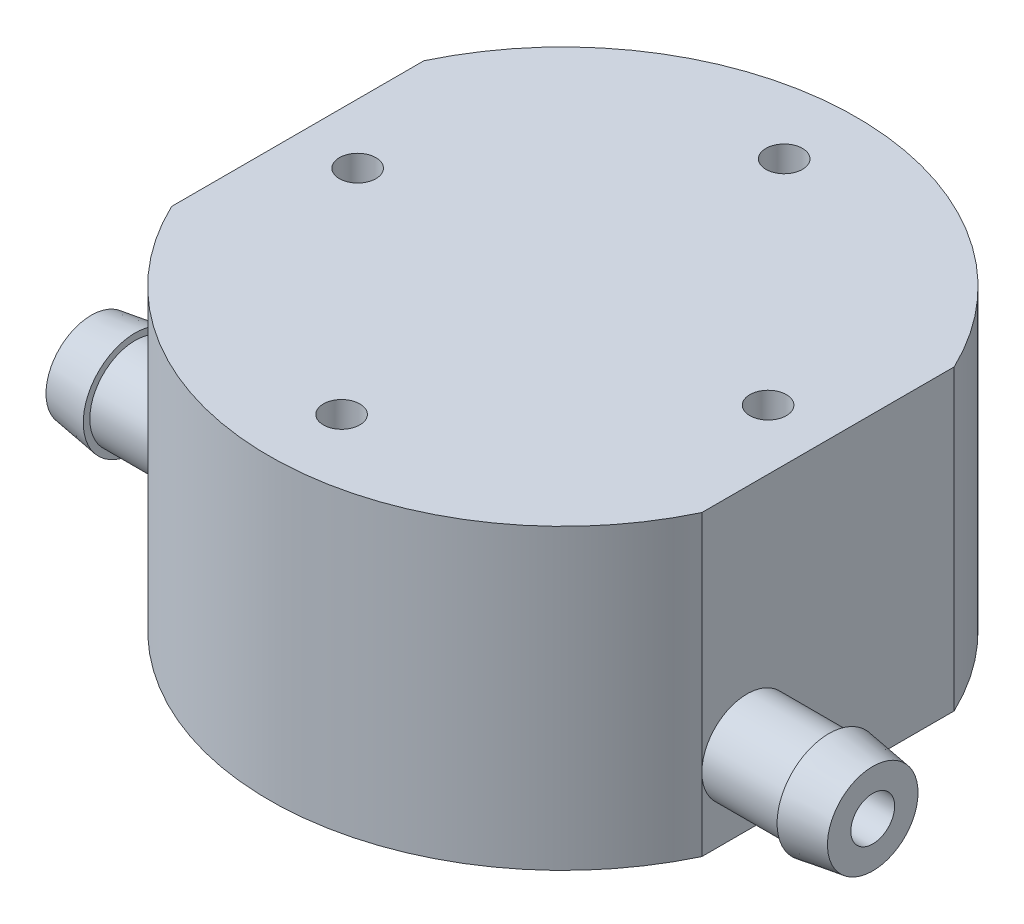
ISO-10303-21;
HEADER;
FILE_DESCRIPTION(('STEP AP214'),'2;1');
FILE_NAME('part.step','',(''),(''),'','','');
FILE_SCHEMA(('AUTOMOTIVE_DESIGN { 1 0 10303 214 1 1 1 1 }'));
ENDSEC;
DATA;
#1=APPLICATION_CONTEXT('core data for automotive mechanical design processes');
#2=APPLICATION_PROTOCOL_DEFINITION('international standard','automotive_design',2000,#1);
#3=PRODUCT_CONTEXT('',#1,'mechanical');
#4=PRODUCT('Part','Part','',(#3));
#5=PRODUCT_RELATED_PRODUCT_CATEGORY('part','',(#4));
#6=PRODUCT_DEFINITION_FORMATION('','',#4);
#7=PRODUCT_DEFINITION_CONTEXT('part definition',#1,'design');
#8=PRODUCT_DEFINITION('design','',#6,#7);
#9=PRODUCT_DEFINITION_SHAPE('','',#8);
#10=(LENGTH_UNIT() NAMED_UNIT(*) SI_UNIT(.MILLI.,.METRE.));
#11=(NAMED_UNIT(*) PLANE_ANGLE_UNIT() SI_UNIT($,.RADIAN.));
#12=(NAMED_UNIT(*) SI_UNIT($,.STERADIAN.) SOLID_ANGLE_UNIT());
#13=UNCERTAINTY_MEASURE_WITH_UNIT(LENGTH_MEASURE(1.E-05),#10,'distance_accuracy_value','');
#14=(GEOMETRIC_REPRESENTATION_CONTEXT(3) GLOBAL_UNCERTAINTY_ASSIGNED_CONTEXT((#13)) GLOBAL_UNIT_ASSIGNED_CONTEXT((#10,
#11,#12)) REPRESENTATION_CONTEXT('',''));
#15=CARTESIAN_POINT('',(0.,0.,0.));
#16=DIRECTION('',(0.,0.,1.));
#17=DIRECTION('',(1.,0.,0.));
#18=AXIS2_PLACEMENT_3D('',#15,#16,#17);
#19=CARTESIAN_POINT('',(0.,-20.4,0.));
#20=DIRECTION('',(0.,1.,0.));
#21=DIRECTION('',(0.,0.,1.));
#22=AXIS2_PLACEMENT_3D('',#19,#20,#21);
#23=CYLINDRICAL_SURFACE('',#22,20.1);
#24=CARTESIAN_POINT('',(0.,0.,0.));
#25=DIRECTION('',(0.,1.,0.));
#26=DIRECTION('',(0.,0.,1.));
#27=AXIS2_PLACEMENT_3D('',#24,#25,#26);
#28=CIRCLE('',#27,20.1);
#29=CARTESIAN_POINT('',(18.15,0.,-8.63640550229087));
#30=VERTEX_POINT('',#29);
#31=CARTESIAN_POINT('',(-18.15,0.,-8.63640550229087));
#32=VERTEX_POINT('',#31);
#33=EDGE_CURVE('E126',#30,#32,#28,.T.);
#34=ORIENTED_EDGE('',*,*,#33,.F.);
#35=DIRECTION('',(0.,1.,0.));
#36=VECTOR('',#35,1.);
#37=CARTESIAN_POINT('',(18.15,-20.4,-8.63640550229087));
#38=LINE('',#37,#36);
#39=CARTESIAN_POINT('',(18.15,-20.4,-8.63640550229087));
#40=VERTEX_POINT('',#39);
#41=EDGE_CURVE('E12',#40,#30,#38,.T.);
#42=ORIENTED_EDGE('',*,*,#41,.F.);
#43=CARTESIAN_POINT('',(0.,-20.4,0.));
#44=DIRECTION('',(0.,1.,0.));
#45=DIRECTION('',(0.,0.,1.));
#46=AXIS2_PLACEMENT_3D('',#43,#44,#45);
#47=CIRCLE('',#46,20.1);
#48=CARTESIAN_POINT('',(-18.15,-20.4,-8.63640550229087));
#49=VERTEX_POINT('',#48);
#50=EDGE_CURVE('E127',#40,#49,#47,.T.);
#51=ORIENTED_EDGE('',*,*,#50,.T.);
#52=DIRECTION('',(0.,1.,0.));
#53=VECTOR('',#52,1.);
#54=CARTESIAN_POINT('',(-18.15,-20.4,-8.63640550229087));
#55=LINE('',#54,#53);
#56=EDGE_CURVE('E140',#49,#32,#55,.T.);
#57=ORIENTED_EDGE('',*,*,#56,.T.);
#58=EDGE_LOOP('',(#34,#42,#51,#57));
#59=FACE_BOUND('',#58,.T.);
#60=ADVANCED_FACE('F38',(#59),#23,.T.);
#61=CARTESIAN_POINT('',(18.15,-20.4,8.63640550229087));
#62=DIRECTION('',(1.,0.,0.));
#63=DIRECTION('',(0.,0.,-1.));
#64=AXIS2_PLACEMENT_3D('',#61,#62,#63);
#65=PLANE('',#64);
#66=DIRECTION('',(0.,1.,0.));
#67=VECTOR('',#66,1.);
#68=CARTESIAN_POINT('',(18.15,-20.4,8.63640550229087));
#69=LINE('',#68,#67);
#70=CARTESIAN_POINT('',(18.15,-15.4,8.63640550229087));
#71=VERTEX_POINT('',#70);
#72=CARTESIAN_POINT('',(18.15,0.,8.63640550229087));
#73=VERTEX_POINT('',#72);
#74=EDGE_CURVE('E153',#71,#73,#69,.T.);
#75=ORIENTED_EDGE('',*,*,#74,.F.);
#76=CARTESIAN_POINT('',(18.15,-15.4,5.53640550229087));
#77=DIRECTION('',(1.,0.,0.));
#78=DIRECTION('',(0.,0.,-1.));
#79=AXIS2_PLACEMENT_3D('',#76,#77,#78);
#80=CIRCLE('',#79,3.1);
#81=EDGE_CURVE('E52',#71,#71,#80,.F.);
#82=ORIENTED_EDGE('',*,*,#81,.T.);
#83=CARTESIAN_POINT('',(18.15,-20.4,8.63640550229087));
#84=VERTEX_POINT('',#83);
#85=EDGE_CURVE('E46',#84,#71,#69,.T.);
#86=ORIENTED_EDGE('',*,*,#85,.F.);
#87=DIRECTION('',(0.,0.,-1.));
#88=VECTOR('',#87,1.);
#89=CARTESIAN_POINT('',(18.15,-20.4,8.63640550229087));
#90=LINE('',#89,#88);
#91=EDGE_CURVE('E137',#84,#40,#90,.T.);
#92=ORIENTED_EDGE('',*,*,#91,.T.);
#93=ORIENTED_EDGE('',*,*,#41,.T.);
#94=DIRECTION('',(0.,0.,-1.));
#95=VECTOR('',#94,1.);
#96=CARTESIAN_POINT('',(18.15,0.,8.63640550229087));
#97=LINE('',#96,#95);
#98=EDGE_CURVE('E131',#73,#30,#97,.T.);
#99=ORIENTED_EDGE('',*,*,#98,.F.);
#100=EDGE_LOOP('',(#75,#82,#86,#92,#93,#99));
#101=FACE_BOUND('',#100,.T.);
#102=ADVANCED_FACE('F177',(#101),#65,.T.);
#103=CARTESIAN_POINT('',(0.,-20.4,0.));
#104=DIRECTION('',(0.,1.,0.));
#105=DIRECTION('',(0.,0.,1.));
#106=AXIS2_PLACEMENT_3D('',#103,#104,#105);
#107=CYLINDRICAL_SURFACE('',#106,20.1);
#108=CARTESIAN_POINT('',(0.,0.,0.));
#109=DIRECTION('',(0.,1.,0.));
#110=DIRECTION('',(0.,0.,1.));
#111=AXIS2_PLACEMENT_3D('',#108,#109,#110);
#112=CIRCLE('',#111,20.1);
#113=CARTESIAN_POINT('',(-18.15,0.,8.63640550229087));
#114=VERTEX_POINT('',#113);
#115=EDGE_CURVE('E146',#114,#73,#112,.T.);
#116=ORIENTED_EDGE('',*,*,#115,.F.);
#117=DIRECTION('',(0.,1.,0.));
#118=VECTOR('',#117,1.);
#119=CARTESIAN_POINT('',(-18.15,-20.4,8.63640550229087));
#120=LINE('',#119,#118);
#121=CARTESIAN_POINT('',(-18.15,-15.4,8.63640550229087));
#122=VERTEX_POINT('',#121);
#123=EDGE_CURVE('E156',#122,#114,#120,.T.);
#124=ORIENTED_EDGE('',*,*,#123,.F.);
#125=CARTESIAN_POINT('',(-18.15,-20.4,8.63640550229087));
#126=VERTEX_POINT('',#125);
#127=EDGE_CURVE('E154',#126,#122,#120,.T.);
#128=ORIENTED_EDGE('',*,*,#127,.F.);
#129=CARTESIAN_POINT('',(0.,-20.4,0.));
#130=DIRECTION('',(0.,1.,0.));
#131=DIRECTION('',(0.,0.,1.));
#132=AXIS2_PLACEMENT_3D('',#129,#130,#131);
#133=CIRCLE('',#132,20.1);
#134=EDGE_CURVE('E134',#126,#84,#133,.T.);
#135=ORIENTED_EDGE('',*,*,#134,.T.);
#136=ORIENTED_EDGE('',*,*,#85,.T.);
#137=ORIENTED_EDGE('',*,*,#74,.T.);
#138=EDGE_LOOP('',(#116,#124,#128,#135,#136,#137));
#139=FACE_BOUND('',#138,.T.);
#140=ADVANCED_FACE('F165',(#139),#107,.T.);
#141=CARTESIAN_POINT('',(-18.15,-20.4,8.63640550229087));
#142=DIRECTION('',(-1.,0.,0.));
#143=DIRECTION('',(0.,0.,1.));
#144=AXIS2_PLACEMENT_3D('',#141,#142,#143);
#145=PLANE('',#144);
#146=ORIENTED_EDGE('',*,*,#127,.T.);
#147=CARTESIAN_POINT('',(-18.15,-15.4,5.53640550229087));
#148=DIRECTION('',(-1.,0.,0.));
#149=DIRECTION('',(0.,0.,1.));
#150=AXIS2_PLACEMENT_3D('',#147,#148,#149);
#151=CIRCLE('',#150,3.1);
#152=EDGE_CURVE('E41',#122,#122,#151,.F.);
#153=ORIENTED_EDGE('',*,*,#152,.T.);
#154=ORIENTED_EDGE('',*,*,#123,.T.);
#155=DIRECTION('',(0.,0.,1.));
#156=VECTOR('',#155,1.);
#157=CARTESIAN_POINT('',(-18.15,0.,8.63640550229087));
#158=LINE('',#157,#156);
#159=EDGE_CURVE('E143',#32,#114,#158,.T.);
#160=ORIENTED_EDGE('',*,*,#159,.F.);
#161=ORIENTED_EDGE('',*,*,#56,.F.);
#162=DIRECTION('',(0.,0.,1.));
#163=VECTOR('',#162,1.);
#164=CARTESIAN_POINT('',(-18.15,-20.4,8.63640550229087));
#165=LINE('',#164,#163);
#166=EDGE_CURVE('E130',#49,#126,#165,.T.);
#167=ORIENTED_EDGE('',*,*,#166,.T.);
#168=EDGE_LOOP('',(#146,#153,#154,#160,#161,#167));
#169=FACE_BOUND('',#168,.T.);
#170=ADVANCED_FACE('F163',(#169),#145,.T.);
#171=CARTESIAN_POINT('',(0.,-20.4,0.));
#172=DIRECTION('',(0.,1.,0.));
#173=DIRECTION('',(0.,0.,1.));
#174=AXIS2_PLACEMENT_3D('',#171,#172,#173);
#175=PLANE('',#174);
#176=ORIENTED_EDGE('',*,*,#50,.F.);
#177=ORIENTED_EDGE('',*,*,#91,.F.);
#178=ORIENTED_EDGE('',*,*,#134,.F.);
#179=ORIENTED_EDGE('',*,*,#166,.F.);
#180=EDGE_LOOP('',(#176,#177,#178,#179));
#181=FACE_BOUND('',#180,.T.);
#182=ADVANCED_FACE('F175',(#181),#175,.F.);
#183=CARTESIAN_POINT('',(0.,0.,0.));
#184=DIRECTION('',(0.,1.,0.));
#185=DIRECTION('',(0.,0.,1.));
#186=AXIS2_PLACEMENT_3D('',#183,#184,#185);
#187=PLANE('',#186);
#188=CARTESIAN_POINT('',(0.,0.,-15.15));
#189=DIRECTION('',(0.,1.,0.));
#190=DIRECTION('',(0.,0.,1.));
#191=AXIS2_PLACEMENT_3D('',#188,#189,#190);
#192=CIRCLE('',#191,1.25);
#193=CARTESIAN_POINT('',(0.,0.,-13.9));
#194=VERTEX_POINT('',#193);
#195=EDGE_CURVE('E103',#194,#194,#192,.T.);
#196=ORIENTED_EDGE('',*,*,#195,.F.);
#197=EDGE_LOOP('',(#196));
#198=FACE_BOUND('',#197,.T.);
#199=CARTESIAN_POINT('',(0.,0.,15.15));
#200=DIRECTION('',(0.,1.,0.));
#201=DIRECTION('',(0.,0.,1.));
#202=AXIS2_PLACEMENT_3D('',#199,#200,#201);
#203=CIRCLE('',#202,1.25);
#204=CARTESIAN_POINT('',(0.,0.,16.4));
#205=VERTEX_POINT('',#204);
#206=EDGE_CURVE('E102',#205,#205,#203,.T.);
#207=ORIENTED_EDGE('',*,*,#206,.F.);
#208=EDGE_LOOP('',(#207));
#209=FACE_BOUND('',#208,.T.);
#210=CARTESIAN_POINT('',(14.05,0.,0.));
#211=DIRECTION('',(0.,1.,0.));
#212=DIRECTION('',(0.,0.,1.));
#213=AXIS2_PLACEMENT_3D('',#210,#211,#212);
#214=CIRCLE('',#213,1.25);
#215=CARTESIAN_POINT('',(14.05,0.,1.25));
#216=VERTEX_POINT('',#215);
#217=EDGE_CURVE('E114',#216,#216,#214,.T.);
#218=ORIENTED_EDGE('',*,*,#217,.F.);
#219=EDGE_LOOP('',(#218));
#220=FACE_BOUND('',#219,.T.);
#221=CARTESIAN_POINT('',(-14.05,0.,0.));
#222=DIRECTION('',(0.,1.,0.));
#223=DIRECTION('',(0.,0.,1.));
#224=AXIS2_PLACEMENT_3D('',#221,#222,#223);
#225=CIRCLE('',#224,1.25);
#226=CARTESIAN_POINT('',(-14.05,0.,1.25));
#227=VERTEX_POINT('',#226);
#228=EDGE_CURVE('E120',#227,#227,#225,.T.);
#229=ORIENTED_EDGE('',*,*,#228,.F.);
#230=EDGE_LOOP('',(#229));
#231=FACE_BOUND('',#230,.T.);
#232=ORIENTED_EDGE('',*,*,#33,.T.);
#233=ORIENTED_EDGE('',*,*,#159,.T.);
#234=ORIENTED_EDGE('',*,*,#115,.T.);
#235=ORIENTED_EDGE('',*,*,#98,.T.);
#236=EDGE_LOOP('',(#232,#233,#234,#235));
#237=FACE_BOUND('',#236,.T.);
#238=ADVANCED_FACE('F169',(#198,#209,#220,#231,#237),#187,.T.);
#239=CARTESIAN_POINT('',(-14.05,-7.5,0.));
#240=DIRECTION('',(0.,1.,0.));
#241=DIRECTION('',(0.,0.,1.));
#242=AXIS2_PLACEMENT_3D('',#239,#240,#241);
#243=CONICAL_SURFACE('',#242,1.25,1.02974425867665);
#244=CARTESIAN_POINT('',(-14.05,-8.25107577378445,0.));
#245=VERTEX_POINT('',#244);
#246=VERTEX_LOOP('',#245);
#247=FACE_BOUND('',#246,.T.);
#248=CARTESIAN_POINT('',(-14.05,-7.5,0.));
#249=DIRECTION('',(0.,1.,0.));
#250=DIRECTION('',(0.,0.,1.));
#251=AXIS2_PLACEMENT_3D('',#248,#249,#250);
#252=CIRCLE('',#251,1.25);
#253=CARTESIAN_POINT('',(-14.05,-7.5,1.25));
#254=VERTEX_POINT('',#253);
#255=EDGE_CURVE('E123',#254,#254,#252,.T.);
#256=ORIENTED_EDGE('',*,*,#255,.T.);
#257=EDGE_LOOP('',(#256));
#258=FACE_BOUND('',#257,.T.);
#259=ADVANCED_FACE('F250',(#247,#258),#243,.F.);
#260=CARTESIAN_POINT('',(-14.05,0.,0.));
#261=DIRECTION('',(0.,1.,0.));
#262=DIRECTION('',(0.,0.,1.));
#263=AXIS2_PLACEMENT_3D('',#260,#261,#262);
#264=CYLINDRICAL_SURFACE('',#263,1.25);
#265=ORIENTED_EDGE('',*,*,#255,.F.);
#266=EDGE_LOOP('',(#265));
#267=FACE_BOUND('',#266,.T.);
#268=ORIENTED_EDGE('',*,*,#228,.T.);
#269=EDGE_LOOP('',(#268));
#270=FACE_BOUND('',#269,.T.);
#271=ADVANCED_FACE('F255',(#267,#270),#264,.F.);
#272=CARTESIAN_POINT('',(14.05,-7.5,0.));
#273=DIRECTION('',(0.,1.,0.));
#274=DIRECTION('',(0.,0.,1.));
#275=AXIS2_PLACEMENT_3D('',#272,#273,#274);
#276=CONICAL_SURFACE('',#275,1.25,1.02974425867665);
#277=CARTESIAN_POINT('',(14.05,-8.25107577378445,0.));
#278=VERTEX_POINT('',#277);
#279=VERTEX_LOOP('',#278);
#280=FACE_BOUND('',#279,.T.);
#281=CARTESIAN_POINT('',(14.05,-7.5,0.));
#282=DIRECTION('',(0.,1.,0.));
#283=DIRECTION('',(0.,0.,1.));
#284=AXIS2_PLACEMENT_3D('',#281,#282,#283);
#285=CIRCLE('',#284,1.25);
#286=CARTESIAN_POINT('',(14.05,-7.5,1.24999999999999));
#287=VERTEX_POINT('',#286);
#288=EDGE_CURVE('E117',#287,#287,#285,.T.);
#289=ORIENTED_EDGE('',*,*,#288,.T.);
#290=EDGE_LOOP('',(#289));
#291=FACE_BOUND('',#290,.T.);
#292=ADVANCED_FACE('F259',(#280,#291),#276,.F.);
#293=CARTESIAN_POINT('',(14.05,0.,0.));
#294=DIRECTION('',(0.,1.,0.));
#295=DIRECTION('',(0.,0.,1.));
#296=AXIS2_PLACEMENT_3D('',#293,#294,#295);
#297=CYLINDRICAL_SURFACE('',#296,1.25);
#298=ORIENTED_EDGE('',*,*,#288,.F.);
#299=EDGE_LOOP('',(#298));
#300=FACE_BOUND('',#299,.T.);
#301=ORIENTED_EDGE('',*,*,#217,.T.);
#302=EDGE_LOOP('',(#301));
#303=FACE_BOUND('',#302,.T.);
#304=ADVANCED_FACE('F263',(#300,#303),#297,.F.);
#305=CARTESIAN_POINT('',(0.,-7.5,15.15));
#306=DIRECTION('',(0.,1.,0.));
#307=DIRECTION('',(0.,0.,1.));
#308=AXIS2_PLACEMENT_3D('',#305,#306,#307);
#309=CONICAL_SURFACE('',#308,1.25,1.02974425867665);
#310=CARTESIAN_POINT('',(0.,-8.25107577378445,15.15));
#311=VERTEX_POINT('',#310);
#312=VERTEX_LOOP('',#311);
#313=FACE_BOUND('',#312,.T.);
#314=CARTESIAN_POINT('',(0.,-7.5,15.15));
#315=DIRECTION('',(0.,1.,0.));
#316=DIRECTION('',(0.,0.,1.));
#317=AXIS2_PLACEMENT_3D('',#314,#315,#316);
#318=CIRCLE('',#317,1.25);
#319=CARTESIAN_POINT('',(0.,-7.5,16.4));
#320=VERTEX_POINT('',#319);
#321=EDGE_CURVE('E106',#320,#320,#318,.T.);
#322=ORIENTED_EDGE('',*,*,#321,.T.);
#323=EDGE_LOOP('',(#322));
#324=FACE_BOUND('',#323,.T.);
#325=ADVANCED_FACE('F267',(#313,#324),#309,.F.);
#326=CARTESIAN_POINT('',(0.,0.,15.15));
#327=DIRECTION('',(0.,1.,0.));
#328=DIRECTION('',(0.,0.,1.));
#329=AXIS2_PLACEMENT_3D('',#326,#327,#328);
#330=CYLINDRICAL_SURFACE('',#329,1.25);
#331=ORIENTED_EDGE('',*,*,#321,.F.);
#332=EDGE_LOOP('',(#331));
#333=FACE_BOUND('',#332,.T.);
#334=ORIENTED_EDGE('',*,*,#206,.T.);
#335=EDGE_LOOP('',(#334));
#336=FACE_BOUND('',#335,.T.);
#337=ADVANCED_FACE('F96',(#333,#336),#330,.F.);
#338=CARTESIAN_POINT('',(0.,-7.5,-15.15));
#339=DIRECTION('',(0.,1.,0.));
#340=DIRECTION('',(0.,0.,1.));
#341=AXIS2_PLACEMENT_3D('',#338,#339,#340);
#342=CONICAL_SURFACE('',#341,1.25,1.02974425867665);
#343=CARTESIAN_POINT('',(0.,-8.25107577378445,-15.15));
#344=VERTEX_POINT('',#343);
#345=VERTEX_LOOP('',#344);
#346=FACE_BOUND('',#345,.T.);
#347=CARTESIAN_POINT('',(0.,-7.5,-15.15));
#348=DIRECTION('',(0.,1.,0.));
#349=DIRECTION('',(0.,0.,1.));
#350=AXIS2_PLACEMENT_3D('',#347,#348,#349);
#351=CIRCLE('',#350,1.25);
#352=CARTESIAN_POINT('',(0.,-7.5,-13.9));
#353=VERTEX_POINT('',#352);
#354=EDGE_CURVE('E100',#353,#353,#351,.T.);
#355=ORIENTED_EDGE('',*,*,#354,.T.);
#356=EDGE_LOOP('',(#355));
#357=FACE_BOUND('',#356,.T.);
#358=ADVANCED_FACE('F92',(#346,#357),#342,.F.);
#359=CARTESIAN_POINT('',(0.,0.,-15.15));
#360=DIRECTION('',(0.,1.,0.));
#361=DIRECTION('',(0.,0.,1.));
#362=AXIS2_PLACEMENT_3D('',#359,#360,#361);
#363=CYLINDRICAL_SURFACE('',#362,1.25);
#364=ORIENTED_EDGE('',*,*,#354,.F.);
#365=EDGE_LOOP('',(#364));
#366=FACE_BOUND('',#365,.T.);
#367=ORIENTED_EDGE('',*,*,#195,.T.);
#368=EDGE_LOOP('',(#367));
#369=FACE_BOUND('',#368,.T.);
#370=ADVANCED_FACE('F95',(#366,#369),#363,.F.);
#371=CARTESIAN_POINT('',(44.1181240867132,-15.4,5.53640550229087));
#372=DIRECTION('',(-1.,0.,0.));
#373=DIRECTION('',(0.,0.,1.));
#374=AXIS2_PLACEMENT_3D('',#371,#372,#373);
#375=CYLINDRICAL_SURFACE('',#374,3.1);
#376=CARTESIAN_POINT('',(-23.75,-15.4,5.53640550229087));
#377=DIRECTION('',(1.,0.,0.));
#378=DIRECTION('',(0.,0.,-1.));
#379=AXIS2_PLACEMENT_3D('',#376,#377,#378);
#380=CIRCLE('',#379,3.1);
#381=CARTESIAN_POINT('',(-23.75,-15.4,2.43640550229087));
#382=VERTEX_POINT('',#381);
#383=EDGE_CURVE('E191',#382,#382,#380,.T.);
#384=ORIENTED_EDGE('',*,*,#383,.T.);
#385=EDGE_LOOP('',(#384));
#386=FACE_BOUND('',#385,.T.);
#387=ORIENTED_EDGE('',*,*,#152,.F.);
#388=EDGE_LOOP('',(#387));
#389=FACE_BOUND('',#388,.T.);
#390=ADVANCED_FACE('F276',(#386,#389),#375,.T.);
#391=CARTESIAN_POINT('',(23.75,-15.4,5.53640550229087));
#392=DIRECTION('',(1.,0.,0.));
#393=DIRECTION('',(0.,0.,-1.));
#394=AXIS2_PLACEMENT_3D('',#391,#392,#393);
#395=CIRCLE('',#394,3.1);
#396=CARTESIAN_POINT('',(23.75,-15.4,2.43640550229087));
#397=VERTEX_POINT('',#396);
#398=EDGE_CURVE('E182',#397,#397,#395,.T.);
#399=ORIENTED_EDGE('',*,*,#398,.F.);
#400=EDGE_LOOP('',(#399));
#401=FACE_BOUND('',#400,.T.);
#402=ORIENTED_EDGE('',*,*,#81,.F.);
#403=EDGE_LOOP('',(#402));
#404=FACE_BOUND('',#403,.T.);
#405=ADVANCED_FACE('F228',(#401,#404),#375,.T.);
#406=CARTESIAN_POINT('',(23.75,-11.85,5.53640550229087));
#407=DIRECTION('',(-1.,0.,0.));
#408=DIRECTION('',(0.,0.,1.));
#409=AXIS2_PLACEMENT_3D('',#406,#407,#408);
#410=PLANE('',#409);
#411=ORIENTED_EDGE('',*,*,#398,.T.);
#412=EDGE_LOOP('',(#411));
#413=FACE_BOUND('',#412,.T.);
#414=CARTESIAN_POINT('',(23.75,-15.4,5.53640550229087));
#415=DIRECTION('',(1.,0.,0.));
#416=DIRECTION('',(0.,0.,-1.));
#417=AXIS2_PLACEMENT_3D('',#414,#415,#416);
#418=CIRCLE('',#417,3.55);
#419=CARTESIAN_POINT('',(23.75,-15.4,1.98640550229087));
#420=VERTEX_POINT('',#419);
#421=EDGE_CURVE('E185',#420,#420,#418,.T.);
#422=ORIENTED_EDGE('',*,*,#421,.F.);
#423=EDGE_LOOP('',(#422));
#424=FACE_BOUND('',#423,.T.);
#425=ADVANCED_FACE('F222',(#413,#424),#410,.T.);
#426=CARTESIAN_POINT('',(26.75,-15.4,5.53640550229087));
#427=DIRECTION('',(-1.,0.,0.));
#428=DIRECTION('',(0.,0.,1.));
#429=AXIS2_PLACEMENT_3D('',#426,#427,#428);
#430=CONICAL_SURFACE('',#429,3.1,0.148889947609497);
#431=ORIENTED_EDGE('',*,*,#421,.T.);
#432=EDGE_LOOP('',(#431));
#433=FACE_BOUND('',#432,.T.);
#434=CARTESIAN_POINT('',(26.75,-15.4,5.53640550229087));
#435=DIRECTION('',(1.,0.,0.));
#436=DIRECTION('',(0.,0.,-1.));
#437=AXIS2_PLACEMENT_3D('',#434,#435,#436);
#438=CIRCLE('',#437,3.1);
#439=CARTESIAN_POINT('',(26.75,-15.4,2.43640550229087));
#440=VERTEX_POINT('',#439);
#441=EDGE_CURVE('E188',#440,#440,#438,.T.);
#442=ORIENTED_EDGE('',*,*,#441,.F.);
#443=EDGE_LOOP('',(#442));
#444=FACE_BOUND('',#443,.T.);
#445=ADVANCED_FACE('F217',(#433,#444),#430,.T.);
#446=CARTESIAN_POINT('',(26.75,-20.4,8.63640550229087));
#447=DIRECTION('',(1.,0.,0.));
#448=DIRECTION('',(0.,0.,-1.));
#449=AXIS2_PLACEMENT_3D('',#446,#447,#448);
#450=PLANE('',#449);
#451=CARTESIAN_POINT('',(26.75,-15.4,5.53640550229087));
#452=DIRECTION('',(1.,0.,0.));
#453=DIRECTION('',(0.,0.,-1.));
#454=AXIS2_PLACEMENT_3D('',#451,#452,#453);
#455=CIRCLE('',#454,1.5);
#456=CARTESIAN_POINT('',(26.75,-15.4,4.03640550229087));
#457=VERTEX_POINT('',#456);
#458=EDGE_CURVE('E198',#457,#457,#455,.T.);
#459=ORIENTED_EDGE('',*,*,#458,.F.);
#460=EDGE_LOOP('',(#459));
#461=FACE_BOUND('',#460,.T.);
#462=ORIENTED_EDGE('',*,*,#441,.T.);
#463=EDGE_LOOP('',(#462));
#464=FACE_BOUND('',#463,.T.);
#465=ADVANCED_FACE('F213',(#461,#464),#450,.T.);
#466=CARTESIAN_POINT('',(-23.75,-11.85,5.53640550229087));
#467=DIRECTION('',(1.,0.,0.));
#468=DIRECTION('',(0.,0.,-1.));
#469=AXIS2_PLACEMENT_3D('',#466,#467,#468);
#470=PLANE('',#469);
#471=CARTESIAN_POINT('',(-23.75,-15.4,5.53640550229087));
#472=DIRECTION('',(1.,0.,0.));
#473=DIRECTION('',(0.,0.,-1.));
#474=AXIS2_PLACEMENT_3D('',#471,#472,#473);
#475=CIRCLE('',#474,3.55);
#476=CARTESIAN_POINT('',(-23.75,-15.4,1.98640550229087));
#477=VERTEX_POINT('',#476);
#478=EDGE_CURVE('E194',#477,#477,#475,.T.);
#479=ORIENTED_EDGE('',*,*,#478,.T.);
#480=EDGE_LOOP('',(#479));
#481=FACE_BOUND('',#480,.T.);
#482=ORIENTED_EDGE('',*,*,#383,.F.);
#483=EDGE_LOOP('',(#482));
#484=FACE_BOUND('',#483,.T.);
#485=ADVANCED_FACE('F216',(#481,#484),#470,.T.);
#486=CARTESIAN_POINT('',(-23.75,-15.4,5.53640550229087));
#487=DIRECTION('',(1.,0.,0.));
#488=DIRECTION('',(0.,0.,-1.));
#489=AXIS2_PLACEMENT_3D('',#486,#487,#488);
#490=CONICAL_SURFACE('',#489,3.55,0.148889947609497);
#491=CARTESIAN_POINT('',(-26.75,-15.4,5.53640550229087));
#492=DIRECTION('',(-1.,0.,0.));
#493=DIRECTION('',(0.,0.,1.));
#494=AXIS2_PLACEMENT_3D('',#491,#492,#493);
#495=CIRCLE('',#494,3.1);
#496=CARTESIAN_POINT('',(-26.75,-15.4,8.63640550229087));
#497=VERTEX_POINT('',#496);
#498=EDGE_CURVE('E178',#497,#497,#495,.F.);
#499=ORIENTED_EDGE('',*,*,#498,.T.);
#500=EDGE_LOOP('',(#499));
#501=FACE_BOUND('',#500,.T.);
#502=ORIENTED_EDGE('',*,*,#478,.F.);
#503=EDGE_LOOP('',(#502));
#504=FACE_BOUND('',#503,.T.);
#505=ADVANCED_FACE('F282',(#501,#504),#490,.T.);
#506=CARTESIAN_POINT('',(-26.75,-20.4,8.63640550229087));
#507=DIRECTION('',(-1.,0.,0.));
#508=DIRECTION('',(0.,0.,1.));
#509=AXIS2_PLACEMENT_3D('',#506,#507,#508);
#510=PLANE('',#509);
#511=CARTESIAN_POINT('',(-26.75,-15.4,5.53640550229087));
#512=DIRECTION('',(1.,0.,0.));
#513=DIRECTION('',(0.,0.,-1.));
#514=AXIS2_PLACEMENT_3D('',#511,#512,#513);
#515=CIRCLE('',#514,1.5);
#516=CARTESIAN_POINT('',(-26.75,-15.4,4.03640550229087));
#517=VERTEX_POINT('',#516);
#518=EDGE_CURVE('E197',#517,#517,#515,.T.);
#519=ORIENTED_EDGE('',*,*,#518,.T.);
#520=EDGE_LOOP('',(#519));
#521=FACE_BOUND('',#520,.T.);
#522=ORIENTED_EDGE('',*,*,#498,.F.);
#523=EDGE_LOOP('',(#522));
#524=FACE_BOUND('',#523,.T.);
#525=ADVANCED_FACE('F204',(#521,#524),#510,.T.);
#526=CARTESIAN_POINT('',(-26.75,-15.4,5.53640550229087));
#527=DIRECTION('',(1.,0.,0.));
#528=DIRECTION('',(0.,0.,-1.));
#529=AXIS2_PLACEMENT_3D('',#526,#527,#528);
#530=CYLINDRICAL_SURFACE('',#529,1.5);
#531=ORIENTED_EDGE('',*,*,#518,.F.);
#532=EDGE_LOOP('',(#531));
#533=FACE_BOUND('',#532,.T.);
#534=ORIENTED_EDGE('',*,*,#458,.T.);
#535=EDGE_LOOP('',(#534));
#536=FACE_BOUND('',#535,.T.);
#537=ADVANCED_FACE('F207',(#533,#536),#530,.F.);
#538=CLOSED_SHELL('',(#60,#102,#140,#170,#182,#238,#259,#271,#292,#304,#325,#337,#358,#370,#390,
#405,#425,#445,#465,#485,#505,#525,#537));
#539=MANIFOLD_SOLID_BREP('B2',#538);
#540=ADVANCED_BREP_SHAPE_REPRESENTATION('',(#18,#539),#14);
#541=SHAPE_DEFINITION_REPRESENTATION(#9,#540);
ENDSEC;
END-ISO-10303-21;
